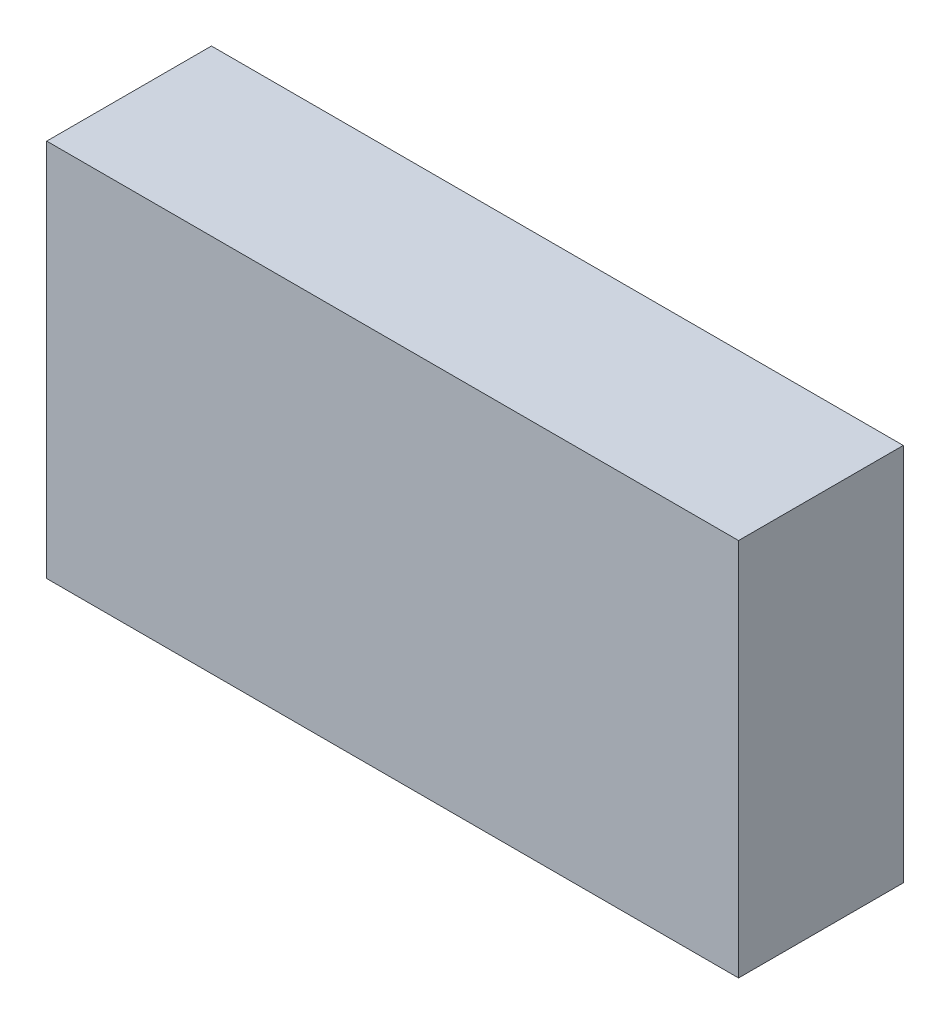
ISO-10303-21;
HEADER;
FILE_DESCRIPTION(('STEP AP214'),'2;1');
FILE_NAME('part.step','',(''),(''),'','','');
FILE_SCHEMA(('AUTOMOTIVE_DESIGN { 1 0 10303 214 1 1 1 1 }'));
ENDSEC;
DATA;
#1=APPLICATION_CONTEXT('core data for automotive mechanical design processes');
#2=APPLICATION_PROTOCOL_DEFINITION('international standard','automotive_design',2000,#1);
#3=PRODUCT_CONTEXT('',#1,'mechanical');
#4=PRODUCT('Part','Part','',(#3));
#5=PRODUCT_RELATED_PRODUCT_CATEGORY('part','',(#4));
#6=PRODUCT_DEFINITION_FORMATION('','',#4);
#7=PRODUCT_DEFINITION_CONTEXT('part definition',#1,'design');
#8=PRODUCT_DEFINITION('design','',#6,#7);
#9=PRODUCT_DEFINITION_SHAPE('','',#8);
#10=(LENGTH_UNIT() NAMED_UNIT(*) SI_UNIT(.MILLI.,.METRE.));
#11=(NAMED_UNIT(*) PLANE_ANGLE_UNIT() SI_UNIT($,.RADIAN.));
#12=(NAMED_UNIT(*) SI_UNIT($,.STERADIAN.) SOLID_ANGLE_UNIT());
#13=UNCERTAINTY_MEASURE_WITH_UNIT(LENGTH_MEASURE(1.E-05),#10,'distance_accuracy_value','');
#14=(GEOMETRIC_REPRESENTATION_CONTEXT(3) GLOBAL_UNCERTAINTY_ASSIGNED_CONTEXT((#13)) GLOBAL_UNIT_ASSIGNED_CONTEXT((#10,
#11,#12)) REPRESENTATION_CONTEXT('',''));
#15=CARTESIAN_POINT('',(0.,0.,0.));
#16=DIRECTION('',(0.,0.,1.));
#17=DIRECTION('',(1.,0.,0.));
#18=AXIS2_PLACEMENT_3D('',#15,#16,#17);
#19=CARTESIAN_POINT('',(-94.9141359988932,38.1474820143885,50.));
#20=DIRECTION('',(1.,0.,0.));
#21=DIRECTION('',(0.,0.,-1.));
#22=AXIS2_PLACEMENT_3D('',#19,#20,#21);
#23=PLANE('',#22);
#24=DIRECTION('',(0.,-1.,0.));
#25=VECTOR('',#24,1.);
#26=CARTESIAN_POINT('',(-94.9141359988932,38.1474820143885,0.));
#27=LINE('',#26,#25);
#28=CARTESIAN_POINT('',(-94.9141359988932,38.1474820143885,0.));
#29=VERTEX_POINT('',#28);
#30=CARTESIAN_POINT('',(-94.9141359988932,-76.8525179856115,0.));
#31=VERTEX_POINT('',#30);
#32=EDGE_CURVE('E107',#29,#31,#27,.T.);
#33=ORIENTED_EDGE('',*,*,#32,.T.);
#34=DIRECTION('',(0.,0.,-1.));
#35=VECTOR('',#34,1.);
#36=CARTESIAN_POINT('',(-94.9141359988932,-76.8525179856115,50.));
#37=LINE('',#36,#35);
#38=CARTESIAN_POINT('',(-94.9141359988932,-76.8525179856115,50.));
#39=VERTEX_POINT('',#38);
#40=EDGE_CURVE('E11',#39,#31,#37,.T.);
#41=ORIENTED_EDGE('',*,*,#40,.F.);
#42=DIRECTION('',(0.,-1.,0.));
#43=VECTOR('',#42,1.);
#44=CARTESIAN_POINT('',(-94.9141359988932,38.1474820143885,50.));
#45=LINE('',#44,#43);
#46=CARTESIAN_POINT('',(-94.9141359988932,38.1474820143885,50.));
#47=VERTEX_POINT('',#46);
#48=EDGE_CURVE('E91',#47,#39,#45,.T.);
#49=ORIENTED_EDGE('',*,*,#48,.F.);
#50=DIRECTION('',(0.,0.,-1.));
#51=VECTOR('',#50,1.);
#52=CARTESIAN_POINT('',(-94.9141359988932,38.1474820143885,50.));
#53=LINE('',#52,#51);
#54=EDGE_CURVE('E103',#47,#29,#53,.T.);
#55=ORIENTED_EDGE('',*,*,#54,.T.);
#56=EDGE_LOOP('',(#33,#41,#49,#55));
#57=FACE_BOUND('',#56,.T.);
#58=ADVANCED_FACE('F39',(#57),#23,.F.);
#59=CARTESIAN_POINT('',(-94.9141359988932,-76.8525179856115,50.));
#60=DIRECTION('',(0.,1.,0.));
#61=DIRECTION('',(0.,0.,1.));
#62=AXIS2_PLACEMENT_3D('',#59,#60,#61);
#63=PLANE('',#62);
#64=DIRECTION('',(1.,0.,0.));
#65=VECTOR('',#64,1.);
#66=CARTESIAN_POINT('',(-94.9141359988932,-76.8525179856115,0.));
#67=LINE('',#66,#65);
#68=CARTESIAN_POINT('',(115.085864001107,-76.8525179856115,0.));
#69=VERTEX_POINT('',#68);
#70=EDGE_CURVE('E96',#31,#69,#67,.T.);
#71=ORIENTED_EDGE('',*,*,#70,.T.);
#72=DIRECTION('',(0.,0.,-1.));
#73=VECTOR('',#72,1.);
#74=CARTESIAN_POINT('',(115.085864001107,-76.8525179856115,50.));
#75=LINE('',#74,#73);
#76=CARTESIAN_POINT('',(115.085864001107,-76.8525179856115,50.));
#77=VERTEX_POINT('',#76);
#78=EDGE_CURVE('E48',#77,#69,#75,.T.);
#79=ORIENTED_EDGE('',*,*,#78,.F.);
#80=DIRECTION('',(1.,0.,0.));
#81=VECTOR('',#80,1.);
#82=CARTESIAN_POINT('',(-94.9141359988932,-76.8525179856115,50.));
#83=LINE('',#82,#81);
#84=EDGE_CURVE('E86',#39,#77,#83,.T.);
#85=ORIENTED_EDGE('',*,*,#84,.F.);
#86=ORIENTED_EDGE('',*,*,#40,.T.);
#87=EDGE_LOOP('',(#71,#79,#85,#86));
#88=FACE_BOUND('',#87,.T.);
#89=ADVANCED_FACE('F95',(#88),#63,.F.);
#90=CARTESIAN_POINT('',(115.085864001107,38.1474820143885,50.));
#91=DIRECTION('',(-1.,0.,0.));
#92=DIRECTION('',(0.,0.,1.));
#93=AXIS2_PLACEMENT_3D('',#90,#91,#92);
#94=PLANE('',#93);
#95=DIRECTION('',(0.,1.,0.));
#96=VECTOR('',#95,1.);
#97=CARTESIAN_POINT('',(115.085864001107,38.1474820143885,0.));
#98=LINE('',#97,#96);
#99=CARTESIAN_POINT('',(115.085864001107,38.1474820143885,0.));
#100=VERTEX_POINT('',#99);
#101=EDGE_CURVE('E73',#69,#100,#98,.T.);
#102=ORIENTED_EDGE('',*,*,#101,.T.);
#103=DIRECTION('',(0.,0.,-1.));
#104=VECTOR('',#103,1.);
#105=CARTESIAN_POINT('',(115.085864001107,38.1474820143885,50.));
#106=LINE('',#105,#104);
#107=CARTESIAN_POINT('',(115.085864001107,38.1474820143885,50.));
#108=VERTEX_POINT('',#107);
#109=EDGE_CURVE('E98',#108,#100,#106,.T.);
#110=ORIENTED_EDGE('',*,*,#109,.F.);
#111=DIRECTION('',(0.,1.,0.));
#112=VECTOR('',#111,1.);
#113=CARTESIAN_POINT('',(115.085864001107,38.1474820143885,50.));
#114=LINE('',#113,#112);
#115=EDGE_CURVE('E89',#77,#108,#114,.T.);
#116=ORIENTED_EDGE('',*,*,#115,.F.);
#117=ORIENTED_EDGE('',*,*,#78,.T.);
#118=EDGE_LOOP('',(#102,#110,#116,#117));
#119=FACE_BOUND('',#118,.T.);
#120=ADVANCED_FACE('F99',(#119),#94,.F.);
#121=CARTESIAN_POINT('',(-94.9141359988932,38.1474820143885,50.));
#122=DIRECTION('',(0.,-1.,0.));
#123=DIRECTION('',(0.,0.,-1.));
#124=AXIS2_PLACEMENT_3D('',#121,#122,#123);
#125=PLANE('',#124);
#126=DIRECTION('',(-1.,0.,0.));
#127=VECTOR('',#126,1.);
#128=CARTESIAN_POINT('',(-94.9141359988932,38.1474820143885,0.));
#129=LINE('',#128,#127);
#130=EDGE_CURVE('E79',#100,#29,#129,.T.);
#131=ORIENTED_EDGE('',*,*,#130,.T.);
#132=ORIENTED_EDGE('',*,*,#54,.F.);
#133=DIRECTION('',(-1.,0.,0.));
#134=VECTOR('',#133,1.);
#135=CARTESIAN_POINT('',(-94.9141359988932,38.1474820143885,50.));
#136=LINE('',#135,#134);
#137=EDGE_CURVE('E56',#108,#47,#136,.T.);
#138=ORIENTED_EDGE('',*,*,#137,.F.);
#139=ORIENTED_EDGE('',*,*,#109,.T.);
#140=EDGE_LOOP('',(#131,#132,#138,#139));
#141=FACE_BOUND('',#140,.T.);
#142=ADVANCED_FACE('F120',(#141),#125,.F.);
#143=CARTESIAN_POINT('',(0.,0.,50.));
#144=DIRECTION('',(0.,0.,1.));
#145=DIRECTION('',(1.,0.,0.));
#146=AXIS2_PLACEMENT_3D('',#143,#144,#145);
#147=PLANE('',#146);
#148=ORIENTED_EDGE('',*,*,#48,.T.);
#149=ORIENTED_EDGE('',*,*,#84,.T.);
#150=ORIENTED_EDGE('',*,*,#115,.T.);
#151=ORIENTED_EDGE('',*,*,#137,.T.);
#152=EDGE_LOOP('',(#148,#149,#150,#151));
#153=FACE_BOUND('',#152,.T.);
#154=ADVANCED_FACE('F87',(#153),#147,.T.);
#155=CARTESIAN_POINT('',(0.,0.,0.));
#156=DIRECTION('',(0.,0.,1.));
#157=DIRECTION('',(1.,0.,0.));
#158=AXIS2_PLACEMENT_3D('',#155,#156,#157);
#159=PLANE('',#158);
#160=ORIENTED_EDGE('',*,*,#32,.F.);
#161=ORIENTED_EDGE('',*,*,#130,.F.);
#162=ORIENTED_EDGE('',*,*,#101,.F.);
#163=ORIENTED_EDGE('',*,*,#70,.F.);
#164=EDGE_LOOP('',(#160,#161,#162,#163));
#165=FACE_BOUND('',#164,.T.);
#166=ADVANCED_FACE('F123',(#165),#159,.F.);
#167=CLOSED_SHELL('',(#58,#89,#120,#142,#154,#166));
#168=MANIFOLD_SOLID_BREP('B2',#167);
#169=ADVANCED_BREP_SHAPE_REPRESENTATION('',(#18,#168),#14);
#170=SHAPE_DEFINITION_REPRESENTATION(#9,#169);
ENDSEC;
END-ISO-10303-21;
